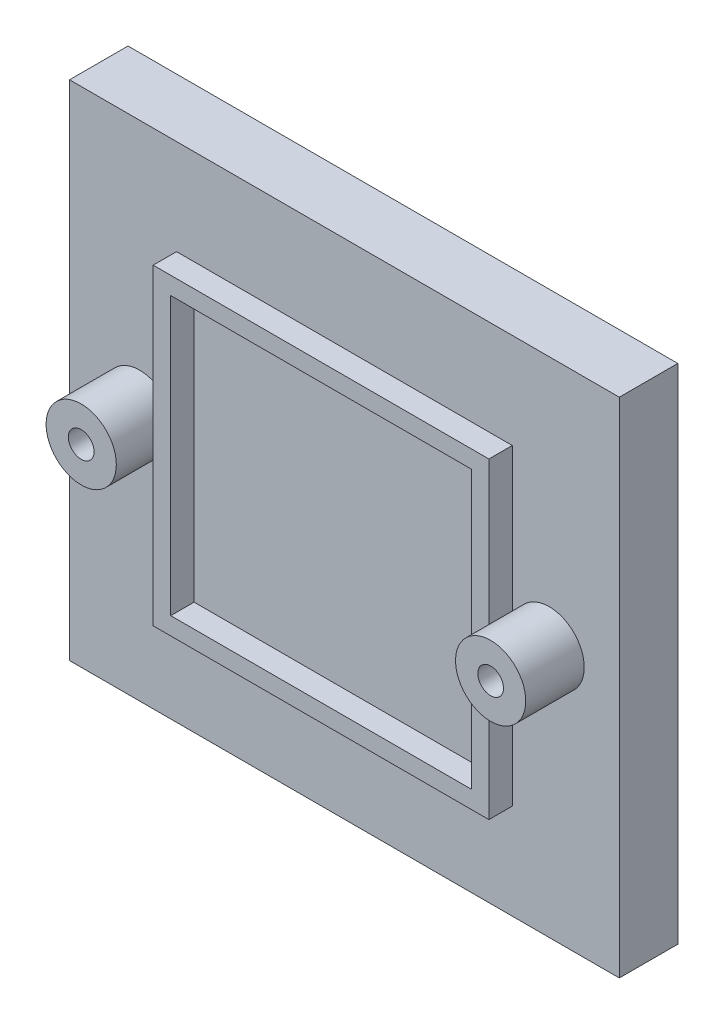
ISO-10303-21;
HEADER;
FILE_DESCRIPTION(('STEP AP214'),'2;1');
FILE_NAME('part.step','',(''),(''),'','','');
FILE_SCHEMA(('AUTOMOTIVE_DESIGN { 1 0 10303 214 1 1 1 1 }'));
ENDSEC;
DATA;
#1=APPLICATION_CONTEXT('core data for automotive mechanical design processes');
#2=APPLICATION_PROTOCOL_DEFINITION('international standard','automotive_design',2000,#1);
#3=PRODUCT_CONTEXT('',#1,'mechanical');
#4=PRODUCT('Part','Part','',(#3));
#5=PRODUCT_RELATED_PRODUCT_CATEGORY('part','',(#4));
#6=PRODUCT_DEFINITION_FORMATION('','',#4);
#7=PRODUCT_DEFINITION_CONTEXT('part definition',#1,'design');
#8=PRODUCT_DEFINITION('design','',#6,#7);
#9=PRODUCT_DEFINITION_SHAPE('','',#8);
#10=(LENGTH_UNIT() NAMED_UNIT(*) SI_UNIT(.MILLI.,.METRE.));
#11=(NAMED_UNIT(*) PLANE_ANGLE_UNIT() SI_UNIT($,.RADIAN.));
#12=(NAMED_UNIT(*) SI_UNIT($,.STERADIAN.) SOLID_ANGLE_UNIT());
#13=UNCERTAINTY_MEASURE_WITH_UNIT(LENGTH_MEASURE(1.E-05),#10,'distance_accuracy_value','');
#14=(GEOMETRIC_REPRESENTATION_CONTEXT(3) GLOBAL_UNCERTAINTY_ASSIGNED_CONTEXT((#13)) GLOBAL_UNIT_ASSIGNED_CONTEXT((#10,
#11,#12)) REPRESENTATION_CONTEXT('',''));
#15=CARTESIAN_POINT('',(0.,0.,0.));
#16=DIRECTION('',(0.,0.,1.));
#17=DIRECTION('',(1.,0.,0.));
#18=AXIS2_PLACEMENT_3D('',#15,#16,#17);
#19=CARTESIAN_POINT('',(0.,13.35,2.));
#20=DIRECTION('',(0.,1.,0.));
#21=DIRECTION('',(0.,0.,1.));
#22=AXIS2_PLACEMENT_3D('',#19,#20,#21);
#23=PLANE('',#22);
#24=DIRECTION('',(1.,0.,0.));
#25=VECTOR('',#24,1.);
#26=CARTESIAN_POINT('',(0.,13.35,0.));
#27=LINE('',#26,#25);
#28=CARTESIAN_POINT('',(-14.35,13.35,0.));
#29=VERTEX_POINT('',#28);
#30=CARTESIAN_POINT('',(14.35,13.35,0.));
#31=VERTEX_POINT('',#30);
#32=EDGE_CURVE('E250',#29,#31,#27,.T.);
#33=ORIENTED_EDGE('',*,*,#32,.F.);
#34=DIRECTION('',(0.,0.,-1.));
#35=VECTOR('',#34,1.);
#36=CARTESIAN_POINT('',(-14.35,13.35,2.));
#37=LINE('',#36,#35);
#38=CARTESIAN_POINT('',(-14.35,13.35,2.));
#39=VERTEX_POINT('',#38);
#40=EDGE_CURVE('E129',#39,#29,#37,.T.);
#41=ORIENTED_EDGE('',*,*,#40,.F.);
#42=DIRECTION('',(1.,0.,0.));
#43=VECTOR('',#42,1.);
#44=CARTESIAN_POINT('',(0.,13.35,2.));
#45=LINE('',#44,#43);
#46=CARTESIAN_POINT('',(14.35,13.35,2.));
#47=VERTEX_POINT('',#46);
#48=EDGE_CURVE('E120',#39,#47,#45,.T.);
#49=ORIENTED_EDGE('',*,*,#48,.T.);
#50=DIRECTION('',(0.,0.,-1.));
#51=VECTOR('',#50,1.);
#52=CARTESIAN_POINT('',(14.35,13.35,2.));
#53=LINE('',#52,#51);
#54=EDGE_CURVE('E58',#47,#31,#53,.T.);
#55=ORIENTED_EDGE('',*,*,#54,.T.);
#56=EDGE_LOOP('',(#33,#41,#49,#55));
#57=FACE_BOUND('',#56,.T.);
#58=ADVANCED_FACE('F40',(#57),#23,.T.);
#59=CARTESIAN_POINT('',(-14.35,0.,2.));
#60=DIRECTION('',(1.,0.,0.));
#61=DIRECTION('',(0.,1.,0.));
#62=AXIS2_PLACEMENT_3D('',#59,#60,#61);
#63=PLANE('',#62);
#64=DIRECTION('',(0.,-1.,0.));
#65=VECTOR('',#64,1.);
#66=CARTESIAN_POINT('',(-14.35,0.,0.));
#67=LINE('',#66,#65);
#68=CARTESIAN_POINT('',(-14.35,-13.35,0.));
#69=VERTEX_POINT('',#68);
#70=EDGE_CURVE('E127',#29,#69,#67,.T.);
#71=ORIENTED_EDGE('',*,*,#70,.T.);
#72=DIRECTION('',(0.,0.,-1.));
#73=VECTOR('',#72,1.);
#74=CARTESIAN_POINT('',(-14.35,-13.35,2.));
#75=LINE('',#74,#73);
#76=CARTESIAN_POINT('',(-14.35,-13.35,2.));
#77=VERTEX_POINT('',#76);
#78=EDGE_CURVE('E107',#77,#69,#75,.T.);
#79=ORIENTED_EDGE('',*,*,#78,.F.);
#80=DIRECTION('',(0.,-1.,0.));
#81=VECTOR('',#80,1.);
#82=CARTESIAN_POINT('',(-14.35,0.,2.));
#83=LINE('',#82,#81);
#84=EDGE_CURVE('E115',#39,#77,#83,.T.);
#85=ORIENTED_EDGE('',*,*,#84,.F.);
#86=ORIENTED_EDGE('',*,*,#40,.T.);
#87=EDGE_LOOP('',(#71,#79,#85,#86));
#88=FACE_BOUND('',#87,.T.);
#89=ADVANCED_FACE('F125',(#88),#63,.F.);
#90=CARTESIAN_POINT('',(0.,-13.35,2.));
#91=DIRECTION('',(0.,1.,0.));
#92=DIRECTION('',(0.,0.,1.));
#93=AXIS2_PLACEMENT_3D('',#90,#91,#92);
#94=PLANE('',#93);
#95=DIRECTION('',(1.,0.,0.));
#96=VECTOR('',#95,1.);
#97=CARTESIAN_POINT('',(0.,-13.35,0.));
#98=LINE('',#97,#96);
#99=CARTESIAN_POINT('',(14.35,-13.35,0.));
#100=VERTEX_POINT('',#99);
#101=EDGE_CURVE('E255',#69,#100,#98,.T.);
#102=ORIENTED_EDGE('',*,*,#101,.T.);
#103=DIRECTION('',(0.,0.,-1.));
#104=VECTOR('',#103,1.);
#105=CARTESIAN_POINT('',(14.35,-13.35,2.));
#106=LINE('',#105,#104);
#107=CARTESIAN_POINT('',(14.35,-13.35,2.));
#108=VERTEX_POINT('',#107);
#109=EDGE_CURVE('E110',#108,#100,#106,.T.);
#110=ORIENTED_EDGE('',*,*,#109,.F.);
#111=DIRECTION('',(1.,0.,0.));
#112=VECTOR('',#111,1.);
#113=CARTESIAN_POINT('',(0.,-13.35,2.));
#114=LINE('',#113,#112);
#115=EDGE_CURVE('E102',#77,#108,#114,.T.);
#116=ORIENTED_EDGE('',*,*,#115,.F.);
#117=ORIENTED_EDGE('',*,*,#78,.T.);
#118=EDGE_LOOP('',(#102,#110,#116,#117));
#119=FACE_BOUND('',#118,.T.);
#120=ADVANCED_FACE('F105',(#119),#94,.F.);
#121=CARTESIAN_POINT('',(0.,11.85,2.));
#122=DIRECTION('',(0.,1.,0.));
#123=DIRECTION('',(0.,0.,1.));
#124=AXIS2_PLACEMENT_3D('',#121,#122,#123);
#125=PLANE('',#124);
#126=DIRECTION('',(1.,0.,0.));
#127=VECTOR('',#126,1.);
#128=CARTESIAN_POINT('',(0.,11.85,0.));
#129=LINE('',#128,#127);
#130=CARTESIAN_POINT('',(-12.85,11.85,0.));
#131=VERTEX_POINT('',#130);
#132=CARTESIAN_POINT('',(12.85,11.85,0.));
#133=VERTEX_POINT('',#132);
#134=EDGE_CURVE('E79',#131,#133,#129,.T.);
#135=ORIENTED_EDGE('',*,*,#134,.T.);
#136=DIRECTION('',(0.,0.,-1.));
#137=VECTOR('',#136,1.);
#138=CARTESIAN_POINT('',(12.85,11.85,2.));
#139=LINE('',#138,#137);
#140=CARTESIAN_POINT('',(12.85,11.85,2.));
#141=VERTEX_POINT('',#140);
#142=EDGE_CURVE('E147',#141,#133,#139,.T.);
#143=ORIENTED_EDGE('',*,*,#142,.F.);
#144=DIRECTION('',(1.,0.,0.));
#145=VECTOR('',#144,1.);
#146=CARTESIAN_POINT('',(0.,11.85,2.));
#147=LINE('',#146,#145);
#148=CARTESIAN_POINT('',(-12.85,11.85,2.));
#149=VERTEX_POINT('',#148);
#150=EDGE_CURVE('E219',#149,#141,#147,.T.);
#151=ORIENTED_EDGE('',*,*,#150,.F.);
#152=DIRECTION('',(0.,0.,-1.));
#153=VECTOR('',#152,1.);
#154=CARTESIAN_POINT('',(-12.85,11.85,2.));
#155=LINE('',#154,#153);
#156=EDGE_CURVE('E137',#149,#131,#155,.T.);
#157=ORIENTED_EDGE('',*,*,#156,.T.);
#158=EDGE_LOOP('',(#135,#143,#151,#157));
#159=FACE_BOUND('',#158,.T.);
#160=ADVANCED_FACE('F42',(#159),#125,.F.);
#161=CARTESIAN_POINT('',(12.85,0.,2.));
#162=DIRECTION('',(1.,0.,0.));
#163=DIRECTION('',(0.,0.,-1.));
#164=AXIS2_PLACEMENT_3D('',#161,#162,#163);
#165=PLANE('',#164);
#166=DIRECTION('',(0.,-1.,0.));
#167=VECTOR('',#166,1.);
#168=CARTESIAN_POINT('',(12.85,0.,0.));
#169=LINE('',#168,#167);
#170=CARTESIAN_POINT('',(12.85,-11.85,0.));
#171=VERTEX_POINT('',#170);
#172=EDGE_CURVE('E241',#133,#171,#169,.T.);
#173=ORIENTED_EDGE('',*,*,#172,.T.);
#174=DIRECTION('',(0.,0.,-1.));
#175=VECTOR('',#174,1.);
#176=CARTESIAN_POINT('',(12.85,-11.85,2.));
#177=LINE('',#176,#175);
#178=CARTESIAN_POINT('',(12.85,-11.85,2.));
#179=VERTEX_POINT('',#178);
#180=EDGE_CURVE('E144',#179,#171,#177,.T.);
#181=ORIENTED_EDGE('',*,*,#180,.F.);
#182=DIRECTION('',(0.,-1.,0.));
#183=VECTOR('',#182,1.);
#184=CARTESIAN_POINT('',(12.85,0.,2.));
#185=LINE('',#184,#183);
#186=EDGE_CURVE('E223',#141,#179,#185,.T.);
#187=ORIENTED_EDGE('',*,*,#186,.F.);
#188=ORIENTED_EDGE('',*,*,#142,.T.);
#189=EDGE_LOOP('',(#173,#181,#187,#188));
#190=FACE_BOUND('',#189,.T.);
#191=ADVANCED_FACE('F274',(#190),#165,.F.);
#192=CARTESIAN_POINT('',(0.,-11.85,2.));
#193=DIRECTION('',(0.,1.,0.));
#194=DIRECTION('',(0.,0.,1.));
#195=AXIS2_PLACEMENT_3D('',#192,#193,#194);
#196=PLANE('',#195);
#197=DIRECTION('',(1.,0.,0.));
#198=VECTOR('',#197,1.);
#199=CARTESIAN_POINT('',(0.,-11.85,0.));
#200=LINE('',#199,#198);
#201=CARTESIAN_POINT('',(-12.85,-11.85,0.));
#202=VERTEX_POINT('',#201);
#203=EDGE_CURVE('E71',#202,#171,#200,.T.);
#204=ORIENTED_EDGE('',*,*,#203,.F.);
#205=DIRECTION('',(0.,0.,-1.));
#206=VECTOR('',#205,1.);
#207=CARTESIAN_POINT('',(-12.85,-11.85,2.));
#208=LINE('',#207,#206);
#209=CARTESIAN_POINT('',(-12.85,-11.85,2.));
#210=VERTEX_POINT('',#209);
#211=EDGE_CURVE('E140',#210,#202,#208,.T.);
#212=ORIENTED_EDGE('',*,*,#211,.F.);
#213=DIRECTION('',(1.,0.,0.));
#214=VECTOR('',#213,1.);
#215=CARTESIAN_POINT('',(0.,-11.85,2.));
#216=LINE('',#215,#214);
#217=EDGE_CURVE('E227',#210,#179,#216,.T.);
#218=ORIENTED_EDGE('',*,*,#217,.T.);
#219=ORIENTED_EDGE('',*,*,#180,.T.);
#220=EDGE_LOOP('',(#204,#212,#218,#219));
#221=FACE_BOUND('',#220,.T.);
#222=ADVANCED_FACE('F283',(#221),#196,.T.);
#223=CARTESIAN_POINT('',(-12.85,0.,2.));
#224=DIRECTION('',(1.,0.,0.));
#225=DIRECTION('',(0.,0.,-1.));
#226=AXIS2_PLACEMENT_3D('',#223,#224,#225);
#227=PLANE('',#226);
#228=DIRECTION('',(0.,-1.,0.));
#229=VECTOR('',#228,1.);
#230=CARTESIAN_POINT('',(-12.85,0.,0.));
#231=LINE('',#230,#229);
#232=EDGE_CURVE('E247',#131,#202,#231,.T.);
#233=ORIENTED_EDGE('',*,*,#232,.F.);
#234=ORIENTED_EDGE('',*,*,#156,.F.);
#235=DIRECTION('',(0.,-1.,0.));
#236=VECTOR('',#235,1.);
#237=CARTESIAN_POINT('',(-12.85,0.,2.));
#238=LINE('',#237,#236);
#239=EDGE_CURVE('E231',#149,#210,#238,.T.);
#240=ORIENTED_EDGE('',*,*,#239,.T.);
#241=ORIENTED_EDGE('',*,*,#211,.T.);
#242=EDGE_LOOP('',(#233,#234,#240,#241));
#243=FACE_BOUND('',#242,.T.);
#244=ADVANCED_FACE('F280',(#243),#227,.T.);
#245=CARTESIAN_POINT('',(14.35,0.,2.));
#246=DIRECTION('',(1.,0.,0.));
#247=DIRECTION('',(0.,1.,0.));
#248=AXIS2_PLACEMENT_3D('',#245,#246,#247);
#249=PLANE('',#248);
#250=DIRECTION('',(0.,-1.,0.));
#251=VECTOR('',#250,1.);
#252=CARTESIAN_POINT('',(14.35,0.,0.));
#253=LINE('',#252,#251);
#254=EDGE_CURVE('E224',#31,#100,#253,.T.);
#255=ORIENTED_EDGE('',*,*,#254,.F.);
#256=ORIENTED_EDGE('',*,*,#54,.F.);
#257=DIRECTION('',(0.,-1.,0.));
#258=VECTOR('',#257,1.);
#259=CARTESIAN_POINT('',(14.35,0.,2.));
#260=LINE('',#259,#258);
#261=EDGE_CURVE('E114',#47,#108,#260,.T.);
#262=ORIENTED_EDGE('',*,*,#261,.T.);
#263=ORIENTED_EDGE('',*,*,#109,.T.);
#264=EDGE_LOOP('',(#255,#256,#262,#263));
#265=FACE_BOUND('',#264,.T.);
#266=ADVANCED_FACE('F266',(#265),#249,.T.);
#267=CARTESIAN_POINT('',(0.,0.,2.));
#268=DIRECTION('',(0.,0.,1.));
#269=DIRECTION('',(1.,0.,0.));
#270=AXIS2_PLACEMENT_3D('',#267,#268,#269);
#271=PLANE('',#270);
#272=ORIENTED_EDGE('',*,*,#150,.T.);
#273=ORIENTED_EDGE('',*,*,#186,.T.);
#274=ORIENTED_EDGE('',*,*,#217,.F.);
#275=ORIENTED_EDGE('',*,*,#239,.F.);
#276=EDGE_LOOP('',(#272,#273,#274,#275));
#277=FACE_BOUND('',#276,.T.);
#278=ORIENTED_EDGE('',*,*,#48,.F.);
#279=ORIENTED_EDGE('',*,*,#84,.T.);
#280=ORIENTED_EDGE('',*,*,#115,.T.);
#281=ORIENTED_EDGE('',*,*,#261,.F.);
#282=EDGE_LOOP('',(#278,#279,#280,#281));
#283=FACE_BOUND('',#282,.T.);
#284=ADVANCED_FACE('F119',(#277,#283),#271,.T.);
#285=CARTESIAN_POINT('',(0.,0.,0.));
#286=DIRECTION('',(0.,0.,1.));
#287=DIRECTION('',(1.,0.,0.));
#288=AXIS2_PLACEMENT_3D('',#285,#286,#287);
#289=PLANE('',#288);
#290=CARTESIAN_POINT('',(17.5,0.,0.));
#291=DIRECTION('',(0.,0.,1.));
#292=DIRECTION('',(1.,0.,0.));
#293=AXIS2_PLACEMENT_3D('',#290,#291,#292);
#294=CIRCLE('',#293,2.99999999999999);
#295=CARTESIAN_POINT('',(20.5,0.,0.));
#296=VERTEX_POINT('',#295);
#297=EDGE_CURVE('E515',#296,#296,#294,.T.);
#298=ORIENTED_EDGE('',*,*,#297,.F.);
#299=EDGE_LOOP('',(#298));
#300=FACE_BOUND('',#299,.T.);
#301=CARTESIAN_POINT('',(-17.5,0.,0.));
#302=DIRECTION('',(0.,0.,1.));
#303=DIRECTION('',(1.,0.,0.));
#304=AXIS2_PLACEMENT_3D('',#301,#302,#303);
#305=CIRCLE('',#304,3.);
#306=CARTESIAN_POINT('',(-14.5,0.,0.));
#307=VERTEX_POINT('',#306);
#308=EDGE_CURVE('E50',#307,#307,#305,.T.);
#309=ORIENTED_EDGE('',*,*,#308,.F.);
#310=EDGE_LOOP('',(#309));
#311=FACE_BOUND('',#310,.T.);
#312=ORIENTED_EDGE('',*,*,#70,.F.);
#313=ORIENTED_EDGE('',*,*,#32,.T.);
#314=ORIENTED_EDGE('',*,*,#254,.T.);
#315=ORIENTED_EDGE('',*,*,#101,.F.);
#316=EDGE_LOOP('',(#312,#313,#314,#315));
#317=FACE_BOUND('',#316,.T.);
#318=DIRECTION('',(0.,-1.,0.));
#319=VECTOR('',#318,1.);
#320=CARTESIAN_POINT('',(-23.5,21.5,0.));
#321=LINE('',#320,#319);
#322=CARTESIAN_POINT('',(-23.5,21.5,0.));
#323=VERTEX_POINT('',#322);
#324=CARTESIAN_POINT('',(-23.5,-21.5,0.));
#325=VERTEX_POINT('',#324);
#326=EDGE_CURVE('E172',#323,#325,#321,.T.);
#327=ORIENTED_EDGE('',*,*,#326,.T.);
#328=DIRECTION('',(1.,0.,0.));
#329=VECTOR('',#328,1.);
#330=CARTESIAN_POINT('',(-23.5,-21.5,0.));
#331=LINE('',#330,#329);
#332=CARTESIAN_POINT('',(23.5,-21.5,0.));
#333=VERTEX_POINT('',#332);
#334=EDGE_CURVE('E176',#325,#333,#331,.T.);
#335=ORIENTED_EDGE('',*,*,#334,.T.);
#336=DIRECTION('',(0.,-1.,0.));
#337=VECTOR('',#336,1.);
#338=CARTESIAN_POINT('',(23.5,21.5,0.));
#339=LINE('',#338,#337);
#340=CARTESIAN_POINT('',(23.5,21.5,0.));
#341=VERTEX_POINT('',#340);
#342=EDGE_CURVE('E189',#341,#333,#339,.T.);
#343=ORIENTED_EDGE('',*,*,#342,.F.);
#344=DIRECTION('',(1.,0.,0.));
#345=VECTOR('',#344,1.);
#346=CARTESIAN_POINT('',(-23.5,21.5,0.));
#347=LINE('',#346,#345);
#348=EDGE_CURVE('E179',#323,#341,#347,.T.);
#349=ORIENTED_EDGE('',*,*,#348,.F.);
#350=EDGE_LOOP('',(#327,#335,#343,#349));
#351=FACE_BOUND('',#350,.T.);
#352=ADVANCED_FACE('F156',(#300,#311,#317,#351),#289,.T.);
#353=CARTESIAN_POINT('',(0.,0.,-5.));
#354=DIRECTION('',(0.,0.,1.));
#355=DIRECTION('',(1.,0.,0.));
#356=AXIS2_PLACEMENT_3D('',#353,#354,#355);
#357=PLANE('',#356);
#358=DIRECTION('',(0.,-1.,0.));
#359=VECTOR('',#358,1.);
#360=CARTESIAN_POINT('',(-23.5,21.5,-5.));
#361=LINE('',#360,#359);
#362=CARTESIAN_POINT('',(-23.5,21.5,-5.));
#363=VERTEX_POINT('',#362);
#364=CARTESIAN_POINT('',(-23.5,-21.5,-5.));
#365=VERTEX_POINT('',#364);
#366=EDGE_CURVE('E203',#363,#365,#361,.T.);
#367=ORIENTED_EDGE('',*,*,#366,.F.);
#368=DIRECTION('',(1.,0.,0.));
#369=VECTOR('',#368,1.);
#370=CARTESIAN_POINT('',(-23.5,21.5,-5.));
#371=LINE('',#370,#369);
#372=CARTESIAN_POINT('',(23.5,21.5,-5.));
#373=VERTEX_POINT('',#372);
#374=EDGE_CURVE('E195',#363,#373,#371,.T.);
#375=ORIENTED_EDGE('',*,*,#374,.T.);
#376=DIRECTION('',(0.,-1.,0.));
#377=VECTOR('',#376,1.);
#378=CARTESIAN_POINT('',(23.5,21.5,-5.));
#379=LINE('',#378,#377);
#380=CARTESIAN_POINT('',(23.5,-21.5,-5.));
#381=VERTEX_POINT('',#380);
#382=EDGE_CURVE('E492',#373,#381,#379,.T.);
#383=ORIENTED_EDGE('',*,*,#382,.T.);
#384=DIRECTION('',(1.,0.,0.));
#385=VECTOR('',#384,1.);
#386=CARTESIAN_POINT('',(-23.5,-21.5,-5.));
#387=LINE('',#386,#385);
#388=EDGE_CURVE('E489',#365,#381,#387,.T.);
#389=ORIENTED_EDGE('',*,*,#388,.F.);
#390=EDGE_LOOP('',(#367,#375,#383,#389));
#391=FACE_BOUND('',#390,.T.);
#392=ADVANCED_FACE('F159',(#391),#357,.F.);
#393=CARTESIAN_POINT('',(-23.5,-21.5,-5.));
#394=DIRECTION('',(0.,-1.,0.));
#395=DIRECTION('',(0.,0.,-1.));
#396=AXIS2_PLACEMENT_3D('',#393,#394,#395);
#397=PLANE('',#396);
#398=ORIENTED_EDGE('',*,*,#334,.F.);
#399=DIRECTION('',(0.,0.,1.));
#400=VECTOR('',#399,1.);
#401=CARTESIAN_POINT('',(-23.5,-21.5,-5.));
#402=LINE('',#401,#400);
#403=EDGE_CURVE('E216',#365,#325,#402,.T.);
#404=ORIENTED_EDGE('',*,*,#403,.F.);
#405=ORIENTED_EDGE('',*,*,#388,.T.);
#406=DIRECTION('',(0.,0.,1.));
#407=VECTOR('',#406,1.);
#408=CARTESIAN_POINT('',(23.5,-21.5,-5.));
#409=LINE('',#408,#407);
#410=EDGE_CURVE('E212',#381,#333,#409,.T.);
#411=ORIENTED_EDGE('',*,*,#410,.T.);
#412=EDGE_LOOP('',(#398,#404,#405,#411));
#413=FACE_BOUND('',#412,.T.);
#414=ADVANCED_FACE('F401',(#413),#397,.T.);
#415=CARTESIAN_POINT('',(23.5,21.5,-5.));
#416=DIRECTION('',(-1.,0.,0.));
#417=DIRECTION('',(0.,0.,1.));
#418=AXIS2_PLACEMENT_3D('',#415,#416,#417);
#419=PLANE('',#418);
#420=ORIENTED_EDGE('',*,*,#342,.T.);
#421=ORIENTED_EDGE('',*,*,#410,.F.);
#422=ORIENTED_EDGE('',*,*,#382,.F.);
#423=DIRECTION('',(0.,0.,1.));
#424=VECTOR('',#423,1.);
#425=CARTESIAN_POINT('',(23.5,21.5,-5.));
#426=LINE('',#425,#424);
#427=EDGE_CURVE('E208',#373,#341,#426,.T.);
#428=ORIENTED_EDGE('',*,*,#427,.T.);
#429=EDGE_LOOP('',(#420,#421,#422,#428));
#430=FACE_BOUND('',#429,.T.);
#431=ADVANCED_FACE('F410',(#430),#419,.F.);
#432=CARTESIAN_POINT('',(-23.5,21.5,-5.));
#433=DIRECTION('',(0.,-1.,0.));
#434=DIRECTION('',(0.,0.,-1.));
#435=AXIS2_PLACEMENT_3D('',#432,#433,#434);
#436=PLANE('',#435);
#437=ORIENTED_EDGE('',*,*,#348,.T.);
#438=ORIENTED_EDGE('',*,*,#427,.F.);
#439=ORIENTED_EDGE('',*,*,#374,.F.);
#440=DIRECTION('',(0.,0.,1.));
#441=VECTOR('',#440,1.);
#442=CARTESIAN_POINT('',(-23.5,21.5,-5.));
#443=LINE('',#442,#441);
#444=EDGE_CURVE('E204',#363,#323,#443,.T.);
#445=ORIENTED_EDGE('',*,*,#444,.T.);
#446=EDGE_LOOP('',(#437,#438,#439,#445));
#447=FACE_BOUND('',#446,.T.);
#448=ADVANCED_FACE('F419',(#447),#436,.F.);
#449=CARTESIAN_POINT('',(-23.5,21.5,-5.));
#450=DIRECTION('',(-1.,0.,0.));
#451=DIRECTION('',(0.,0.,1.));
#452=AXIS2_PLACEMENT_3D('',#449,#450,#451);
#453=PLANE('',#452);
#454=ORIENTED_EDGE('',*,*,#326,.F.);
#455=ORIENTED_EDGE('',*,*,#444,.F.);
#456=ORIENTED_EDGE('',*,*,#366,.T.);
#457=ORIENTED_EDGE('',*,*,#403,.T.);
#458=EDGE_LOOP('',(#454,#455,#456,#457));
#459=FACE_BOUND('',#458,.T.);
#460=ADVANCED_FACE('F428',(#459),#453,.T.);
#461=ORIENTED_EDGE('',*,*,#134,.F.);
#462=ORIENTED_EDGE('',*,*,#232,.T.);
#463=ORIENTED_EDGE('',*,*,#203,.T.);
#464=ORIENTED_EDGE('',*,*,#172,.F.);
#465=EDGE_LOOP('',(#461,#462,#463,#464));
#466=FACE_BOUND('',#465,.T.);
#467=ADVANCED_FACE('F163',(#466),#289,.T.);
#468=CARTESIAN_POINT('',(-17.5,0.,5.));
#469=DIRECTION('',(0.,0.,-1.));
#470=DIRECTION('',(-1.,0.,0.));
#471=AXIS2_PLACEMENT_3D('',#468,#469,#470);
#472=CYLINDRICAL_SURFACE('',#471,3.);
#473=CARTESIAN_POINT('',(-17.5,0.,5.));
#474=DIRECTION('',(0.,0.,1.));
#475=DIRECTION('',(1.,0.,0.));
#476=AXIS2_PLACEMENT_3D('',#473,#474,#475);
#477=CIRCLE('',#476,3.);
#478=CARTESIAN_POINT('',(-14.5,0.,5.));
#479=VERTEX_POINT('',#478);
#480=EDGE_CURVE('E192',#479,#479,#477,.F.);
#481=ORIENTED_EDGE('',*,*,#480,.T.);
#482=EDGE_LOOP('',(#481));
#483=FACE_BOUND('',#482,.T.);
#484=ORIENTED_EDGE('',*,*,#308,.T.);
#485=EDGE_LOOP('',(#484));
#486=FACE_BOUND('',#485,.T.);
#487=ADVANCED_FACE('F154',(#483,#486),#472,.T.);
#488=CARTESIAN_POINT('',(-17.5,0.,5.));
#489=DIRECTION('',(0.,0.,-1.));
#490=DIRECTION('',(-1.,0.,0.));
#491=AXIS2_PLACEMENT_3D('',#488,#489,#490);
#492=CYLINDRICAL_SURFACE('',#491,1.1);
#493=CARTESIAN_POINT('',(-17.5,0.,5.));
#494=DIRECTION('',(0.,0.,1.));
#495=DIRECTION('',(1.,0.,0.));
#496=AXIS2_PLACEMENT_3D('',#493,#494,#495);
#497=CIRCLE('',#496,1.1);
#498=CARTESIAN_POINT('',(-16.4,0.,5.));
#499=VERTEX_POINT('',#498);
#500=EDGE_CURVE('E185',#499,#499,#497,.F.);
#501=ORIENTED_EDGE('',*,*,#500,.F.);
#502=EDGE_LOOP('',(#501));
#503=FACE_BOUND('',#502,.T.);
#504=CARTESIAN_POINT('',(-17.5,0.,0.));
#505=DIRECTION('',(0.,0.,1.));
#506=DIRECTION('',(1.,0.,0.));
#507=AXIS2_PLACEMENT_3D('',#504,#505,#506);
#508=CIRCLE('',#507,1.1);
#509=CARTESIAN_POINT('',(-16.4,0.,0.));
#510=VERTEX_POINT('',#509);
#511=EDGE_CURVE('E473',#510,#510,#508,.F.);
#512=ORIENTED_EDGE('',*,*,#511,.T.);
#513=EDGE_LOOP('',(#512));
#514=FACE_BOUND('',#513,.T.);
#515=ADVANCED_FACE('F339',(#503,#514),#492,.F.);
#516=CARTESIAN_POINT('',(0.,0.,5.));
#517=DIRECTION('',(0.,0.,1.));
#518=DIRECTION('',(1.,0.,0.));
#519=AXIS2_PLACEMENT_3D('',#516,#517,#518);
#520=PLANE('',#519);
#521=ORIENTED_EDGE('',*,*,#480,.F.);
#522=EDGE_LOOP('',(#521));
#523=FACE_BOUND('',#522,.T.);
#524=ORIENTED_EDGE('',*,*,#500,.T.);
#525=EDGE_LOOP('',(#524));
#526=FACE_BOUND('',#525,.T.);
#527=ADVANCED_FACE('F349',(#523,#526),#520,.T.);
#528=ORIENTED_EDGE('',*,*,#511,.F.);
#529=EDGE_LOOP('',(#528));
#530=FACE_BOUND('',#529,.T.);
#531=ADVANCED_FACE('F358',(#530),#289,.T.);
#532=CARTESIAN_POINT('',(17.5,0.,5.));
#533=DIRECTION('',(0.,0.,-1.));
#534=DIRECTION('',(-1.,0.,0.));
#535=AXIS2_PLACEMENT_3D('',#532,#533,#534);
#536=CYLINDRICAL_SURFACE('',#535,1.1);
#537=CARTESIAN_POINT('',(17.5,0.,5.));
#538=DIRECTION('',(0.,0.,1.));
#539=DIRECTION('',(1.,0.,0.));
#540=AXIS2_PLACEMENT_3D('',#537,#538,#539);
#541=CIRCLE('',#540,1.1);
#542=CARTESIAN_POINT('',(18.6,0.,5.));
#543=VERTEX_POINT('',#542);
#544=EDGE_CURVE('E483',#543,#543,#541,.T.);
#545=ORIENTED_EDGE('',*,*,#544,.T.);
#546=EDGE_LOOP('',(#545));
#547=FACE_BOUND('',#546,.T.);
#548=CARTESIAN_POINT('',(17.5,0.,0.));
#549=DIRECTION('',(0.,0.,1.));
#550=DIRECTION('',(1.,0.,0.));
#551=AXIS2_PLACEMENT_3D('',#548,#549,#550);
#552=CIRCLE('',#551,1.1);
#553=CARTESIAN_POINT('',(18.6,0.,0.));
#554=VERTEX_POINT('',#553);
#555=EDGE_CURVE('E11',#554,#554,#552,.F.);
#556=ORIENTED_EDGE('',*,*,#555,.T.);
#557=EDGE_LOOP('',(#556));
#558=FACE_BOUND('',#557,.T.);
#559=ADVANCED_FACE('F363',(#547,#558),#536,.F.);
#560=CARTESIAN_POINT('',(17.5,0.,5.));
#561=DIRECTION('',(0.,0.,-1.));
#562=DIRECTION('',(-1.,0.,0.));
#563=AXIS2_PLACEMENT_3D('',#560,#561,#562);
#564=CYLINDRICAL_SURFACE('',#563,2.99999999999999);
#565=CARTESIAN_POINT('',(17.5,0.,5.));
#566=DIRECTION('',(0.,0.,1.));
#567=DIRECTION('',(1.,0.,0.));
#568=AXIS2_PLACEMENT_3D('',#565,#566,#567);
#569=CIRCLE('',#568,2.99999999999999);
#570=CARTESIAN_POINT('',(20.5,0.,5.));
#571=VERTEX_POINT('',#570);
#572=EDGE_CURVE('E476',#571,#571,#569,.T.);
#573=ORIENTED_EDGE('',*,*,#572,.F.);
#574=EDGE_LOOP('',(#573));
#575=FACE_BOUND('',#574,.T.);
#576=ORIENTED_EDGE('',*,*,#297,.T.);
#577=EDGE_LOOP('',(#576));
#578=FACE_BOUND('',#577,.T.);
#579=ADVANCED_FACE('F369',(#575,#578),#564,.T.);
#580=CARTESIAN_POINT('',(0.,0.,5.));
#581=DIRECTION('',(0.,0.,1.));
#582=DIRECTION('',(1.,0.,0.));
#583=AXIS2_PLACEMENT_3D('',#580,#581,#582);
#584=PLANE('',#583);
#585=ORIENTED_EDGE('',*,*,#544,.F.);
#586=EDGE_LOOP('',(#585));
#587=FACE_BOUND('',#586,.T.);
#588=ORIENTED_EDGE('',*,*,#572,.T.);
#589=EDGE_LOOP('',(#588));
#590=FACE_BOUND('',#589,.T.);
#591=ADVANCED_FACE('F378',(#587,#590),#584,.T.);
#592=ORIENTED_EDGE('',*,*,#555,.F.);
#593=EDGE_LOOP('',(#592));
#594=FACE_BOUND('',#593,.T.);
#595=ADVANCED_FACE('F162',(#594),#289,.T.);
#596=CLOSED_SHELL('',(#58,#89,#120,#160,#191,#222,#244,#266,#284,#352,#392,#414,#431,#448,#460,
#467,#487,#515,#527,#531,#559,#579,#591,#595));
#597=MANIFOLD_SOLID_BREP('B2',#596);
#598=ADVANCED_BREP_SHAPE_REPRESENTATION('',(#18,#597),#14);
#599=SHAPE_DEFINITION_REPRESENTATION(#9,#598);
ENDSEC;
END-ISO-10303-21;
